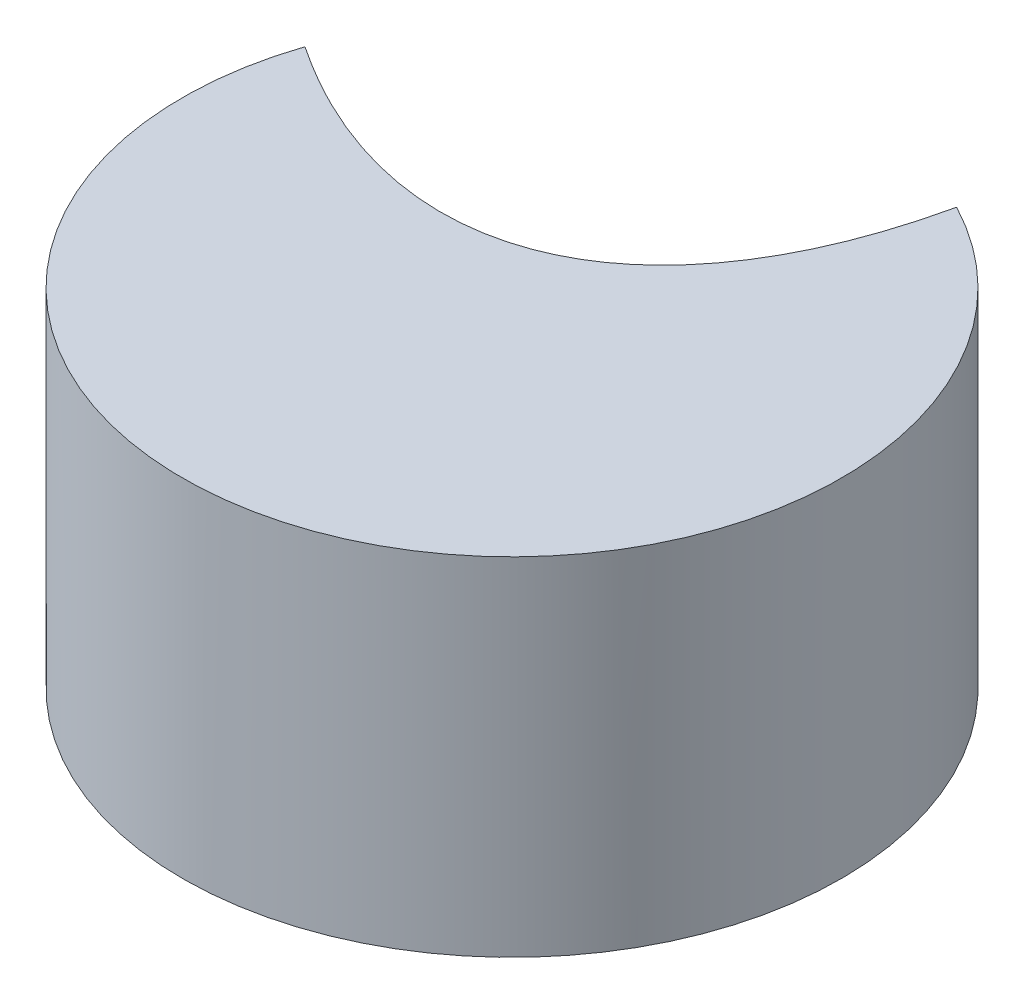
ISO-10303-21;
HEADER;
FILE_DESCRIPTION(('STEP AP214'),'2;1');
FILE_NAME('part.step','',(''),(''),'','','');
FILE_SCHEMA(('AUTOMOTIVE_DESIGN { 1 0 10303 214 1 1 1 1 }'));
ENDSEC;
DATA;
#1=APPLICATION_CONTEXT('core data for automotive mechanical design processes');
#2=APPLICATION_PROTOCOL_DEFINITION('international standard','automotive_design',2000,#1);
#3=PRODUCT_CONTEXT('',#1,'mechanical');
#4=PRODUCT('Part','Part','',(#3));
#5=PRODUCT_RELATED_PRODUCT_CATEGORY('part','',(#4));
#6=PRODUCT_DEFINITION_FORMATION('','',#4);
#7=PRODUCT_DEFINITION_CONTEXT('part definition',#1,'design');
#8=PRODUCT_DEFINITION('design','',#6,#7);
#9=PRODUCT_DEFINITION_SHAPE('','',#8);
#10=(LENGTH_UNIT() NAMED_UNIT(*) SI_UNIT(.MILLI.,.METRE.));
#11=(NAMED_UNIT(*) PLANE_ANGLE_UNIT() SI_UNIT($,.RADIAN.));
#12=(NAMED_UNIT(*) SI_UNIT($,.STERADIAN.) SOLID_ANGLE_UNIT());
#13=UNCERTAINTY_MEASURE_WITH_UNIT(LENGTH_MEASURE(1.E-05),#10,'distance_accuracy_value','');
#14=(GEOMETRIC_REPRESENTATION_CONTEXT(3) GLOBAL_UNCERTAINTY_ASSIGNED_CONTEXT((#13)) GLOBAL_UNIT_ASSIGNED_CONTEXT((#10,
#11,#12)) REPRESENTATION_CONTEXT('',''));
#15=CARTESIAN_POINT('',(0.,0.,0.));
#16=DIRECTION('',(0.,0.,1.));
#17=DIRECTION('',(1.,0.,0.));
#18=AXIS2_PLACEMENT_3D('',#15,#16,#17);
#19=CARTESIAN_POINT('',(-56.2916512459885,-97.7,30.));
#20=DIRECTION('',(0.,1.,0.));
#21=DIRECTION('',(0.,0.,1.));
#22=AXIS2_PLACEMENT_3D('',#19,#20,#21);
#23=CYLINDRICAL_SURFACE('',#22,3.8);
#24=CARTESIAN_POINT('',(-56.2916512459885,-97.,30.));
#25=DIRECTION('',(0.,-1.,0.));
#26=DIRECTION('',(0.,0.,-1.));
#27=AXIS2_PLACEMENT_3D('',#24,#25,#26);
#28=CIRCLE('',#27,3.8);
#29=CARTESIAN_POINT('',(-54.5328304369495,-97.,26.6315360530813));
#30=VERTEX_POINT('',#29);
#31=CARTESIAN_POINT('',(-59.8926135009129,-97.,28.7862987028886));
#32=VERTEX_POINT('',#31);
#33=EDGE_CURVE('E47',#30,#32,#28,.T.);
#34=ORIENTED_EDGE('',*,*,#33,.T.);
#35=CARTESIAN_POINT('',(-59.8925914569327,-96.9998,28.786233301987));
#36=CARTESIAN_POINT('',(-59.9003894789123,-97.0705546747354,28.8093674630436));
#37=CARTESIAN_POINT('',(-59.9076711048667,-97.1416227927385,28.8317076234368));
#38=CARTESIAN_POINT('',(-59.9212568364274,-97.2843968994103,28.8746246034395));
#39=CARTESIAN_POINT('',(-59.9275607496952,-97.3561030106608,28.8952010757355));
#40=CARTESIAN_POINT('',(-59.9451300673006,-97.5727136817751,28.9541612611767));
#41=CARTESIAN_POINT('',(-59.9549931284428,-97.7185595063866,28.9895927121675));
#42=CARTESIAN_POINT('',(-59.9714710949708,-98.0158920594204,29.0513319027936));
#43=CARTESIAN_POINT('',(-59.9780061107234,-98.1674313864205,29.0774111569784));
#44=CARTESIAN_POINT('',(-59.9875575161809,-98.4721704684842,29.1164270389066));
#45=CARTESIAN_POINT('',(-59.9905799099917,-98.6253669371333,29.1293860880443));
#46=CARTESIAN_POINT('',(-59.9922924003672,-98.8659999089151,29.1367203096097));
#47=CARTESIAN_POINT('',(-59.9922897724835,-98.9532633070037,29.1367042786355));
#48=CARTESIAN_POINT('',(-59.9908736721881,-99.1275942839115,29.1306509542962));
#49=CARTESIAN_POINT('',(-59.9894601617542,-99.21466185739,29.1246134986582));
#50=CARTESIAN_POINT('',(-59.9849959187456,-99.3874862827804,29.1059660787108));
#51=CARTESIAN_POINT('',(-59.9819559696164,-99.473247984399,29.093399419327));
#52=CARTESIAN_POINT('',(-59.9739162279926,-99.6433678720104,29.0612778618108));
#53=CARTESIAN_POINT('',(-59.9689165989618,-99.727726174454,29.0417235465552));
#54=CARTESIAN_POINT('',(-59.9564748565576,-99.8952399752276,28.9951845779482));
#55=CARTESIAN_POINT('',(-59.9490054809198,-99.9783707074235,28.9681175569696));
#56=CARTESIAN_POINT('',(-59.9311531164198,-100.141642311545,28.9068198586489));
#57=CARTESIAN_POINT('',(-59.9207697273455,-100.22178277107,28.8725881974758));
#58=CARTESIAN_POINT('',(-59.8965720338857,-100.378437216735,28.7974599044711));
#59=CARTESIAN_POINT('',(-59.8827540783681,-100.454947239775,28.756556195898));
#60=CARTESIAN_POINT('',(-59.8512121144113,-100.603678553575,28.6689518838892));
#61=CARTESIAN_POINT('',(-59.8334899573245,-100.675901856538,28.6222540325753));
#62=CARTESIAN_POINT('',(-59.800983700861,-100.790159616009,28.5420167824031));
#63=CARTESIAN_POINT('',(-59.7874928121077,-100.83358075225,28.50990543231));
#64=CARTESIAN_POINT('',(-59.7587143087419,-100.918387540099,28.4441203188567));
#65=CARTESIAN_POINT('',(-59.7434320968312,-100.959778804244,28.4104514300198));
#66=CARTESIAN_POINT('',(-59.727188273866,-101.0002,28.3760894944355));
#67=B_SPLINE_CURVE_WITH_KNOTS('',3,(#35,#36,#37,#38,#39,#40,#41,#42,#43,#44,#45,#46,#47,#48,#49,
#50,#51,#52,#53,#54,#55,#56,#57,#58,#59,#60,#61,#62,#63,#64,#65,#66),.UNSPECIFIED.,.F.,.F.,(4,2,
2,2,2,2,2,2,2,2,2,2,2,2,2,4),(0.,0.224529608607502,0.449103331512417,0.899999438099021,
1.36126182999431,1.82173462355424,2.08334352968175,2.34495948616094,2.60486201655757,
2.86474287218572,3.12759392537994,3.39048109634731,3.65364893503418,3.91669224847531,
4.08360469898819,4.25002609611647),.UNSPECIFIED.);
#68=CARTESIAN_POINT('',(-59.7272686237187,-101.,28.3762594930721));
#69=VERTEX_POINT('',#68);
#70=EDGE_CURVE('E65',#32,#69,#67,.T.);
#71=ORIENTED_EDGE('',*,*,#70,.T.);
#72=CARTESIAN_POINT('',(-56.2916512459885,-101.,30.));
#73=DIRECTION('',(0.,-1.,0.));
#74=DIRECTION('',(0.,0.,-1.));
#75=AXIS2_PLACEMENT_3D('',#72,#73,#74);
#76=CIRCLE('',#75,3.8);
#77=CARTESIAN_POINT('',(-54.9359840099452,-101.,26.4500469939563));
#78=VERTEX_POINT('',#77);
#79=EDGE_CURVE('E85',#78,#69,#76,.T.);
#80=ORIENTED_EDGE('',*,*,#79,.F.);
#81=CARTESIAN_POINT('',(-54.9361596697651,-101.0002,26.4499799174107));
#82=CARTESIAN_POINT('',(-54.8844101487378,-100.941314470494,26.4697324113325));
#83=CARTESIAN_POINT('',(-54.8351577751465,-100.880334472737,26.489841643348));
#84=CARTESIAN_POINT('',(-54.7419776648878,-100.754374278326,26.5299750032429));
#85=CARTESIAN_POINT('',(-54.6980518318024,-100.689392664025,26.5499990982438));
#86=CARTESIAN_POINT('',(-54.6161271243733,-100.556042110918,26.5890365880717));
#87=CARTESIAN_POINT('',(-54.5780958340019,-100.487694636403,26.6080551018866));
#88=CARTESIAN_POINT('',(-54.5078999745482,-100.347645833791,26.6444382487657));
#89=CARTESIAN_POINT('',(-54.4757341804233,-100.275945209957,26.6618032268174));
#90=CARTESIAN_POINT('',(-54.4172674795637,-100.129422236479,26.6942762593181));
#91=CARTESIAN_POINT('',(-54.3909855442771,-100.054590686642,26.7093769627738));
#92=CARTESIAN_POINT('',(-54.3443432373264,-99.9025749564758,26.7367617070259));
#93=CARTESIAN_POINT('',(-54.3239852236582,-99.8253898527917,26.7490446258025));
#94=CARTESIAN_POINT('',(-54.2889812610416,-99.6693551529714,26.770489959704));
#95=CARTESIAN_POINT('',(-54.2743327464445,-99.5905063212864,26.7796537762088));
#96=CARTESIAN_POINT('',(-54.2503659655614,-99.4316928256814,26.7947929120763));
#97=CARTESIAN_POINT('',(-54.2410492940395,-99.3517278352348,26.8007672774323));
#98=CARTESIAN_POINT('',(-54.2243226830078,-99.1563821489884,26.811536098311));
#99=CARTESIAN_POINT('',(-54.219493494858,-99.0406874090679,26.8146941981381));
#100=CARTESIAN_POINT('',(-54.2184945209268,-98.8092431130936,26.8153475694749));
#101=CARTESIAN_POINT('',(-54.2223297957012,-98.6934935645023,26.8128395316271));
#102=CARTESIAN_POINT('',(-54.2374296526581,-98.4621048722978,26.8030871024966));
#103=CARTESIAN_POINT('',(-54.2487328437688,-98.3464694469416,26.7958180988484));
#104=CARTESIAN_POINT('',(-54.2777516186852,-98.1163673648676,26.777500993584));
#105=CARTESIAN_POINT('',(-54.2954657622457,-98.001900451573,26.7664537407966));
#106=CARTESIAN_POINT('',(-54.3432810854946,-97.7367003729433,26.7373517485648));
#107=CARTESIAN_POINT('',(-54.3755411453039,-97.5864778116716,26.718187679508));
#108=CARTESIAN_POINT('',(-54.4301951562732,-97.3639688517672,26.6870836987032));
#109=CARTESIAN_POINT('',(-54.449331738521,-97.2906762454686,26.6763896508338));
#110=CARTESIAN_POINT('',(-54.4896215609705,-97.14474722216,26.6543735886725));
#111=CARTESIAN_POINT('',(-54.5107746668953,-97.0721107618106,26.6430516162139));
#112=CARTESIAN_POINT('',(-54.5328916156796,-96.9998,26.6315041097256));
#113=B_SPLINE_CURVE_WITH_KNOTS('',3,(#81,#82,#83,#84,#85,#86,#87,#88,#89,#90,#91,#92,#93,#94,
#95,#96,#97,#98,#99,#100,#101,#102,#103,#104,#105,#106,#107,#108,#109,#110,#111,#112),
.UNSPECIFIED.,.F.,.F.,(4,2,2,2,2,2,2,2,2,2,2,2,2,2,2,4),(0.,0.242487812446091,0.485062030598377,
0.726250914982047,0.967389367841494,1.2092944754156,1.4512957411489,1.69318813428321,
1.93515284012404,2.28209096716263,2.62923177885385,2.97818149210642,3.32705286107756,
3.79116730720974,4.02064608070599,4.25010958426818),.UNSPECIFIED.);
#114=EDGE_CURVE('E100',#78,#30,#113,.T.);
#115=ORIENTED_EDGE('',*,*,#114,.T.);
#116=EDGE_LOOP('',(#34,#71,#80,#115));
#117=FACE_BOUND('',#116,.T.);
#118=ADVANCED_FACE('F41',(#117),#23,.T.);
#119=CARTESIAN_POINT('',(-56.2916512459885,-97.,30.));
#120=DIRECTION('',(0.,-1.,0.));
#121=DIRECTION('',(0.,0.,-1.));
#122=AXIS2_PLACEMENT_3D('',#119,#120,#121);
#123=PLANE('',#122);
#124=ORIENTED_EDGE('',*,*,#33,.F.);
#125=CARTESIAN_POINT('',(-60.4195676971179,-97.,19.7321699509699));
#126=DIRECTION('',(0.,-1.,0.));
#127=DIRECTION('',(-0.373009193509687,0.,-0.927827646471721));
#128=AXIS2_PLACEMENT_3D('',#125,#126,#127);
#129=ELLIPSE('',#128,10.5033012386468,5.02786274995615);
#130=EDGE_CURVE('E84',#30,#32,#129,.T.);
#131=ORIENTED_EDGE('',*,*,#130,.T.);
#132=EDGE_LOOP('',(#124,#131));
#133=FACE_BOUND('',#132,.T.);
#134=ADVANCED_FACE('F108',(#133),#123,.F.);
#135=CARTESIAN_POINT('',(-56.2916512459885,-101.,30.));
#136=DIRECTION('',(0.,-1.,0.));
#137=DIRECTION('',(0.,0.,-1.));
#138=AXIS2_PLACEMENT_3D('',#135,#136,#137);
#139=PLANE('',#138);
#140=CARTESIAN_POINT('',(-57.2135245359946,-101.,27.7069210628203));
#141=DIRECTION('',(0.,-1.,0.));
#142=DIRECTION('',(-0.373009193509687,0.,-0.927827646471721));
#143=AXIS2_PLACEMENT_3D('',#140,#141,#142);
#144=ELLIPSE('',#143,5.40311255334577,2.58643522865269);
#145=CARTESIAN_POINT('',(-54.5642688393494,-101.,27.4258690745742));
#146=VERTEX_POINT('',#145);
#147=EDGE_CURVE('E57',#78,#146,#144,.T.);
#148=ORIENTED_EDGE('',*,*,#147,.F.);
#149=ORIENTED_EDGE('',*,*,#79,.T.);
#150=CARTESIAN_POINT('',(-59.3201048785821,-101.,29.3378303878681));
#151=VERTEX_POINT('',#150);
#152=EDGE_CURVE('E71',#151,#69,#144,.T.);
#153=ORIENTED_EDGE('',*,*,#152,.F.);
#154=CARTESIAN_POINT('',(-56.2916512459885,-101.,30.));
#155=DIRECTION('',(0.,-1.,0.));
#156=DIRECTION('',(0.,0.,-1.));
#157=AXIS2_PLACEMENT_3D('',#154,#155,#156);
#158=CIRCLE('',#157,3.1);
#159=EDGE_CURVE('E79',#146,#151,#158,.T.);
#160=ORIENTED_EDGE('',*,*,#159,.F.);
#161=EDGE_LOOP('',(#148,#149,#153,#160));
#162=FACE_BOUND('',#161,.T.);
#163=ADVANCED_FACE('F77',(#162),#139,.T.);
#164=CARTESIAN_POINT('',(-56.2916512459885,-101.,30.));
#165=DIRECTION('',(0.,0.,-1.));
#166=DIRECTION('',(-1.,0.,0.));
#167=AXIS2_PLACEMENT_3D('',#164,#165,#166);
#168=SPHERICAL_SURFACE('',#167,3.1);
#169=ORIENTED_EDGE('',*,*,#159,.T.);
#170=CARTESIAN_POINT('',(-56.7536771150602,-100.208810505388,28.8507511820919));
#171=DIRECTION('',(0.314352663124664,-0.538308656109163,0.781924672807028));
#172=DIRECTION('',(0.,-0.823680084758126,-0.567054775108055));
#173=AXIS2_PLACEMENT_3D('',#170,#171,#172);
#174=CIRCLE('',#173,2.72942822482299);
#175=EDGE_CURVE('E11',#151,#146,#174,.F.);
#176=ORIENTED_EDGE('',*,*,#175,.T.);
#177=EDGE_LOOP('',(#169,#176));
#178=FACE_BOUND('',#177,.T.);
#179=ADVANCED_FACE('F82',(#178),#168,.F.);
#180=CARTESIAN_POINT('',(-56.2916512459885,-101.,30.));
#181=DIRECTION('',(-0.314352663124664,0.538308656109163,-0.781924672807028));
#182=DIRECTION('',(0.,0.823680084758126,0.567054775108055));
#183=AXIS2_PLACEMENT_3D('',#180,#181,#182);
#184=CONICAL_SURFACE('',#183,2.30000000000002,0.284261523704202);
#185=ORIENTED_EDGE('',*,*,#114,.F.);
#186=ORIENTED_EDGE('',*,*,#147,.T.);
#187=ORIENTED_EDGE('',*,*,#175,.F.);
#188=ORIENTED_EDGE('',*,*,#152,.T.);
#189=ORIENTED_EDGE('',*,*,#70,.F.);
#190=ORIENTED_EDGE('',*,*,#130,.F.);
#191=EDGE_LOOP('',(#185,#186,#187,#188,#189,#190));
#192=FACE_BOUND('',#191,.T.);
#193=ADVANCED_FACE('F75',(#192),#184,.F.);
#194=CLOSED_SHELL('',(#118,#134,#163,#179,#193));
#195=MANIFOLD_SOLID_BREP('B2',#194);
#196=ADVANCED_BREP_SHAPE_REPRESENTATION('',(#18,#195),#14);
#197=SHAPE_DEFINITION_REPRESENTATION(#9,#196);
ENDSEC;
END-ISO-10303-21;
